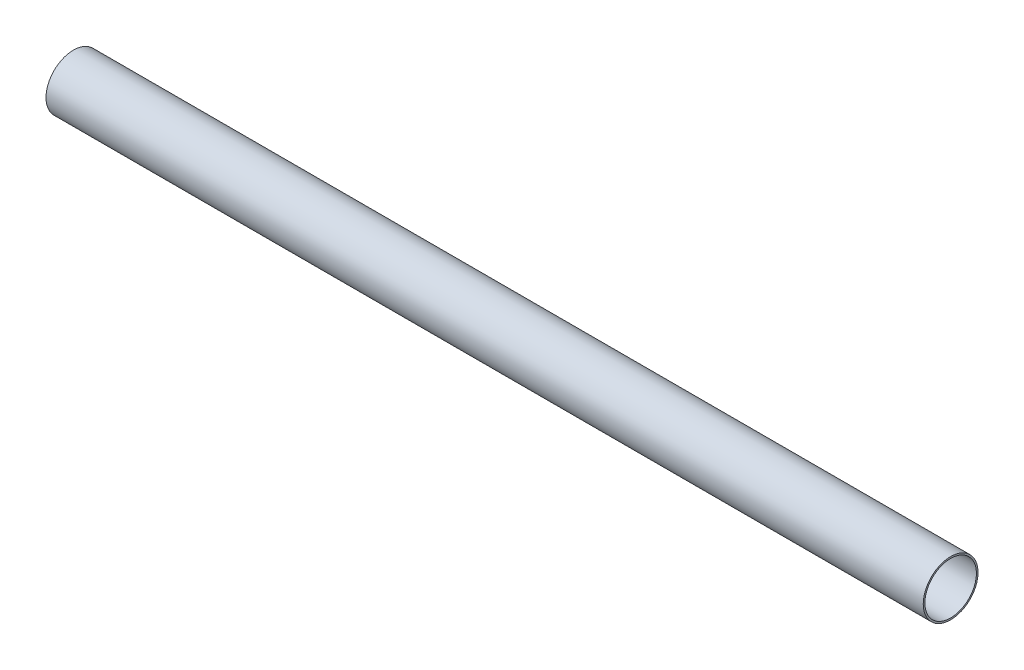
ISO-10303-21;
HEADER;
FILE_DESCRIPTION(('STEP AP214'),'2;1');
FILE_NAME('part.step','',(''),(''),'','','');
FILE_SCHEMA(('AUTOMOTIVE_DESIGN { 1 0 10303 214 1 1 1 1 }'));
ENDSEC;
DATA;
#1=APPLICATION_CONTEXT('core data for automotive mechanical design processes');
#2=APPLICATION_PROTOCOL_DEFINITION('international standard','automotive_design',2000,#1);
#3=PRODUCT_CONTEXT('',#1,'mechanical');
#4=PRODUCT('Part','Part','',(#3));
#5=PRODUCT_RELATED_PRODUCT_CATEGORY('part','',(#4));
#6=PRODUCT_DEFINITION_FORMATION('','',#4);
#7=PRODUCT_DEFINITION_CONTEXT('part definition',#1,'design');
#8=PRODUCT_DEFINITION('design','',#6,#7);
#9=PRODUCT_DEFINITION_SHAPE('','',#8);
#10=(LENGTH_UNIT() NAMED_UNIT(*) SI_UNIT(.MILLI.,.METRE.));
#11=(NAMED_UNIT(*) PLANE_ANGLE_UNIT() SI_UNIT($,.RADIAN.));
#12=(NAMED_UNIT(*) SI_UNIT($,.STERADIAN.) SOLID_ANGLE_UNIT());
#13=UNCERTAINTY_MEASURE_WITH_UNIT(LENGTH_MEASURE(1.E-05),#10,'distance_accuracy_value','');
#14=(GEOMETRIC_REPRESENTATION_CONTEXT(3) GLOBAL_UNCERTAINTY_ASSIGNED_CONTEXT((#13)) GLOBAL_UNIT_ASSIGNED_CONTEXT((#10,
#11,#12)) REPRESENTATION_CONTEXT('',''));
#15=CARTESIAN_POINT('',(0.,0.,0.));
#16=DIRECTION('',(0.,0.,1.));
#17=DIRECTION('',(1.,0.,0.));
#18=AXIS2_PLACEMENT_3D('',#15,#16,#17);
#19=CARTESIAN_POINT('',(-55.,2.5,0.));
#20=DIRECTION('',(1.,0.,0.));
#21=DIRECTION('',(0.,0.,-1.));
#22=AXIS2_PLACEMENT_3D('',#19,#20,#21);
#23=PLANE('',#22);
#24=CARTESIAN_POINT('',(-55.,0.,0.));
#25=DIRECTION('',(-1.,0.,0.));
#26=DIRECTION('',(0.,0.,1.));
#27=AXIS2_PLACEMENT_3D('',#24,#25,#26);
#28=CIRCLE('',#27,2.35);
#29=CARTESIAN_POINT('',(-55.,0.,2.35));
#30=VERTEX_POINT('',#29);
#31=EDGE_CURVE('E10',#30,#30,#28,.T.);
#32=ORIENTED_EDGE('',*,*,#31,.F.);
#33=EDGE_LOOP('',(#32));
#34=FACE_BOUND('',#33,.T.);
#35=CARTESIAN_POINT('',(-55.,0.,0.));
#36=DIRECTION('',(-1.,0.,0.));
#37=DIRECTION('',(0.,0.,1.));
#38=AXIS2_PLACEMENT_3D('',#35,#36,#37);
#39=CIRCLE('',#38,2.5);
#40=CARTESIAN_POINT('',(-55.,0.,2.5));
#41=VERTEX_POINT('',#40);
#42=EDGE_CURVE('E43',#41,#41,#39,.T.);
#43=ORIENTED_EDGE('',*,*,#42,.T.);
#44=EDGE_LOOP('',(#43));
#45=FACE_BOUND('',#44,.T.);
#46=ADVANCED_FACE('F29',(#34,#45),#23,.F.);
#47=CARTESIAN_POINT('',(-151.415188976106,0.,0.));
#48=DIRECTION('',(-1.,0.,0.));
#49=DIRECTION('',(0.,0.,1.));
#50=AXIS2_PLACEMENT_3D('',#47,#48,#49);
#51=CYLINDRICAL_SURFACE('',#50,2.35);
#52=CARTESIAN_POINT('',(25.,0.,0.));
#53=DIRECTION('',(-1.,0.,0.));
#54=DIRECTION('',(0.,0.,1.));
#55=AXIS2_PLACEMENT_3D('',#52,#53,#54);
#56=CIRCLE('',#55,2.35);
#57=CARTESIAN_POINT('',(25.,0.,2.35));
#58=VERTEX_POINT('',#57);
#59=EDGE_CURVE('E35',#58,#58,#56,.T.);
#60=ORIENTED_EDGE('',*,*,#59,.F.);
#61=EDGE_LOOP('',(#60));
#62=FACE_BOUND('',#61,.T.);
#63=ORIENTED_EDGE('',*,*,#31,.T.);
#64=EDGE_LOOP('',(#63));
#65=FACE_BOUND('',#64,.T.);
#66=ADVANCED_FACE('F58',(#62,#65),#51,.F.);
#67=CARTESIAN_POINT('',(25.,2.5,0.));
#68=DIRECTION('',(-1.,0.,0.));
#69=DIRECTION('',(0.,0.,1.));
#70=AXIS2_PLACEMENT_3D('',#67,#68,#69);
#71=PLANE('',#70);
#72=CARTESIAN_POINT('',(25.,0.,0.));
#73=DIRECTION('',(-1.,0.,0.));
#74=DIRECTION('',(0.,0.,1.));
#75=AXIS2_PLACEMENT_3D('',#72,#73,#74);
#76=CIRCLE('',#75,2.5);
#77=CARTESIAN_POINT('',(25.,0.,2.5));
#78=VERTEX_POINT('',#77);
#79=EDGE_CURVE('E39',#78,#78,#76,.T.);
#80=ORIENTED_EDGE('',*,*,#79,.F.);
#81=EDGE_LOOP('',(#80));
#82=FACE_BOUND('',#81,.T.);
#83=ORIENTED_EDGE('',*,*,#59,.T.);
#84=EDGE_LOOP('',(#83));
#85=FACE_BOUND('',#84,.T.);
#86=ADVANCED_FACE('F53',(#82,#85),#71,.F.);
#87=CARTESIAN_POINT('',(-151.415188976106,0.,0.));
#88=DIRECTION('',(-1.,0.,0.));
#89=DIRECTION('',(0.,0.,1.));
#90=AXIS2_PLACEMENT_3D('',#87,#88,#89);
#91=CYLINDRICAL_SURFACE('',#90,2.5);
#92=ORIENTED_EDGE('',*,*,#42,.F.);
#93=EDGE_LOOP('',(#92));
#94=FACE_BOUND('',#93,.T.);
#95=ORIENTED_EDGE('',*,*,#79,.T.);
#96=EDGE_LOOP('',(#95));
#97=FACE_BOUND('',#96,.T.);
#98=ADVANCED_FACE('F50',(#94,#97),#91,.T.);
#99=CLOSED_SHELL('',(#46,#66,#86,#98));
#100=MANIFOLD_SOLID_BREP('B2',#99);
#101=ADVANCED_BREP_SHAPE_REPRESENTATION('',(#18,#100),#14);
#102=SHAPE_DEFINITION_REPRESENTATION(#9,#101);
ENDSEC;
END-ISO-10303-21;
